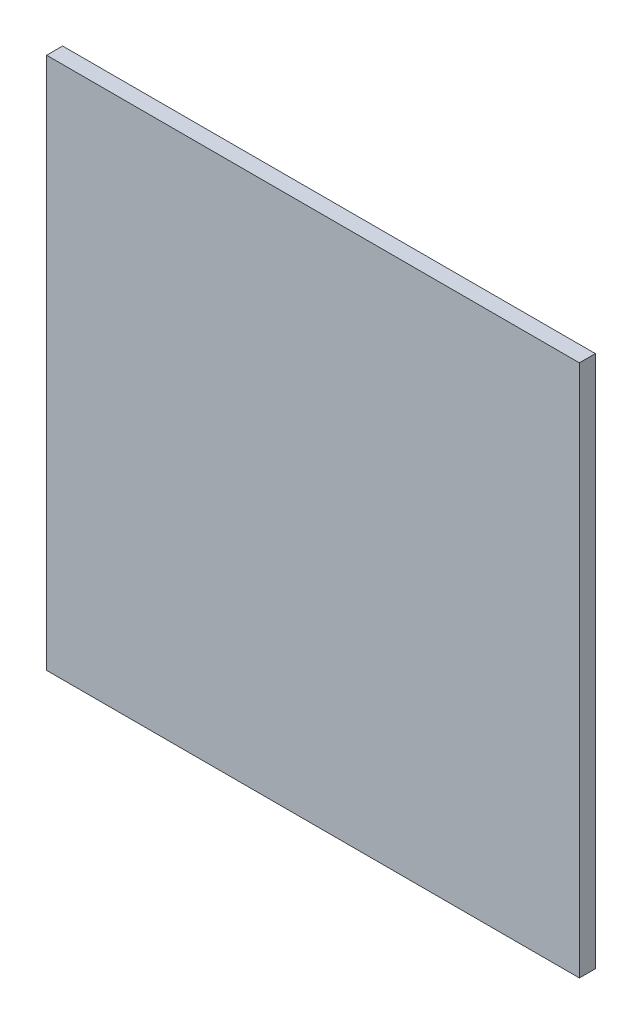
ISO-10303-21;
HEADER;
FILE_DESCRIPTION(('STEP AP214'),'2;1');
FILE_NAME('part.step','',(''),(''),'','','');
FILE_SCHEMA(('AUTOMOTIVE_DESIGN { 1 0 10303 214 1 1 1 1 }'));
ENDSEC;
DATA;
#1=APPLICATION_CONTEXT('core data for automotive mechanical design processes');
#2=APPLICATION_PROTOCOL_DEFINITION('international standard','automotive_design',2000,#1);
#3=PRODUCT_CONTEXT('',#1,'mechanical');
#4=PRODUCT('Part','Part','',(#3));
#5=PRODUCT_RELATED_PRODUCT_CATEGORY('part','',(#4));
#6=PRODUCT_DEFINITION_FORMATION('','',#4);
#7=PRODUCT_DEFINITION_CONTEXT('part definition',#1,'design');
#8=PRODUCT_DEFINITION('design','',#6,#7);
#9=PRODUCT_DEFINITION_SHAPE('','',#8);
#10=(LENGTH_UNIT() NAMED_UNIT(*) SI_UNIT(.MILLI.,.METRE.));
#11=(NAMED_UNIT(*) PLANE_ANGLE_UNIT() SI_UNIT($,.RADIAN.));
#12=(NAMED_UNIT(*) SI_UNIT($,.STERADIAN.) SOLID_ANGLE_UNIT());
#13=UNCERTAINTY_MEASURE_WITH_UNIT(LENGTH_MEASURE(1.E-05),#10,'distance_accuracy_value','');
#14=(GEOMETRIC_REPRESENTATION_CONTEXT(3) GLOBAL_UNCERTAINTY_ASSIGNED_CONTEXT((#13)) GLOBAL_UNIT_ASSIGNED_CONTEXT((#10,
#11,#12)) REPRESENTATION_CONTEXT('',''));
#15=CARTESIAN_POINT('',(0.,0.,0.));
#16=DIRECTION('',(0.,0.,1.));
#17=DIRECTION('',(1.,0.,0.));
#18=AXIS2_PLACEMENT_3D('',#15,#16,#17);
#19=CARTESIAN_POINT('',(50.,-50.,3.));
#20=DIRECTION('',(-1.,0.,0.));
#21=DIRECTION('',(0.,-1.,0.));
#22=AXIS2_PLACEMENT_3D('',#19,#20,#21);
#23=PLANE('',#22);
#24=DIRECTION('',(0.,1.,0.));
#25=VECTOR('',#24,1.);
#26=CARTESIAN_POINT('',(50.,-50.,0.));
#27=LINE('',#26,#25);
#28=CARTESIAN_POINT('',(50.,-50.,0.));
#29=VERTEX_POINT('',#28);
#30=CARTESIAN_POINT('',(50.,50.,0.));
#31=VERTEX_POINT('',#30);
#32=EDGE_CURVE('E96',#29,#31,#27,.T.);
#33=ORIENTED_EDGE('',*,*,#32,.T.);
#34=DIRECTION('',(0.,0.,-1.));
#35=VECTOR('',#34,1.);
#36=CARTESIAN_POINT('',(50.,50.,3.));
#37=LINE('',#36,#35);
#38=CARTESIAN_POINT('',(50.,50.,3.));
#39=VERTEX_POINT('',#38);
#40=EDGE_CURVE('E11',#39,#31,#37,.T.);
#41=ORIENTED_EDGE('',*,*,#40,.F.);
#42=DIRECTION('',(0.,1.,0.));
#43=VECTOR('',#42,1.);
#44=CARTESIAN_POINT('',(50.,-50.,3.));
#45=LINE('',#44,#43);
#46=CARTESIAN_POINT('',(50.,-50.,3.));
#47=VERTEX_POINT('',#46);
#48=EDGE_CURVE('E84',#47,#39,#45,.T.);
#49=ORIENTED_EDGE('',*,*,#48,.F.);
#50=DIRECTION('',(0.,0.,-1.));
#51=VECTOR('',#50,1.);
#52=CARTESIAN_POINT('',(50.,-50.,3.));
#53=LINE('',#52,#51);
#54=EDGE_CURVE('E92',#47,#29,#53,.T.);
#55=ORIENTED_EDGE('',*,*,#54,.T.);
#56=EDGE_LOOP('',(#33,#41,#49,#55));
#57=FACE_BOUND('',#56,.T.);
#58=ADVANCED_FACE('F33',(#57),#23,.F.);
#59=CARTESIAN_POINT('',(-50.,50.,3.));
#60=DIRECTION('',(0.,-1.,0.));
#61=DIRECTION('',(0.,0.,-1.));
#62=AXIS2_PLACEMENT_3D('',#59,#60,#61);
#63=PLANE('',#62);
#64=DIRECTION('',(-1.,0.,0.));
#65=VECTOR('',#64,1.);
#66=CARTESIAN_POINT('',(-50.,50.,0.));
#67=LINE('',#66,#65);
#68=CARTESIAN_POINT('',(-50.,50.,0.));
#69=VERTEX_POINT('',#68);
#70=EDGE_CURVE('E88',#31,#69,#67,.T.);
#71=ORIENTED_EDGE('',*,*,#70,.T.);
#72=DIRECTION('',(0.,0.,-1.));
#73=VECTOR('',#72,1.);
#74=CARTESIAN_POINT('',(-50.,50.,3.));
#75=LINE('',#74,#73);
#76=CARTESIAN_POINT('',(-50.,50.,3.));
#77=VERTEX_POINT('',#76);
#78=EDGE_CURVE('E41',#77,#69,#75,.T.);
#79=ORIENTED_EDGE('',*,*,#78,.F.);
#80=DIRECTION('',(-1.,0.,0.));
#81=VECTOR('',#80,1.);
#82=CARTESIAN_POINT('',(-50.,50.,3.));
#83=LINE('',#82,#81);
#84=EDGE_CURVE('E79',#39,#77,#83,.T.);
#85=ORIENTED_EDGE('',*,*,#84,.F.);
#86=ORIENTED_EDGE('',*,*,#40,.T.);
#87=EDGE_LOOP('',(#71,#79,#85,#86));
#88=FACE_BOUND('',#87,.T.);
#89=ADVANCED_FACE('F87',(#88),#63,.F.);
#90=CARTESIAN_POINT('',(-50.,-50.,3.));
#91=DIRECTION('',(1.,0.,0.));
#92=DIRECTION('',(0.,1.,0.));
#93=AXIS2_PLACEMENT_3D('',#90,#91,#92);
#94=PLANE('',#93);
#95=DIRECTION('',(0.,-1.,0.));
#96=VECTOR('',#95,1.);
#97=CARTESIAN_POINT('',(-50.,-50.,0.));
#98=LINE('',#97,#96);
#99=CARTESIAN_POINT('',(-50.,-50.,0.));
#100=VERTEX_POINT('',#99);
#101=EDGE_CURVE('E66',#69,#100,#98,.T.);
#102=ORIENTED_EDGE('',*,*,#101,.T.);
#103=DIRECTION('',(0.,0.,-1.));
#104=VECTOR('',#103,1.);
#105=CARTESIAN_POINT('',(-50.,-50.,3.));
#106=LINE('',#105,#104);
#107=CARTESIAN_POINT('',(-50.,-50.,3.));
#108=VERTEX_POINT('',#107);
#109=EDGE_CURVE('E89',#108,#100,#106,.T.);
#110=ORIENTED_EDGE('',*,*,#109,.F.);
#111=DIRECTION('',(0.,-1.,0.));
#112=VECTOR('',#111,1.);
#113=CARTESIAN_POINT('',(-50.,-50.,3.));
#114=LINE('',#113,#112);
#115=EDGE_CURVE('E82',#77,#108,#114,.T.);
#116=ORIENTED_EDGE('',*,*,#115,.F.);
#117=ORIENTED_EDGE('',*,*,#78,.T.);
#118=EDGE_LOOP('',(#102,#110,#116,#117));
#119=FACE_BOUND('',#118,.T.);
#120=ADVANCED_FACE('F90',(#119),#94,.F.);
#121=CARTESIAN_POINT('',(-50.,-50.,3.));
#122=DIRECTION('',(0.,1.,0.));
#123=DIRECTION('',(0.,0.,1.));
#124=AXIS2_PLACEMENT_3D('',#121,#122,#123);
#125=PLANE('',#124);
#126=DIRECTION('',(1.,0.,0.));
#127=VECTOR('',#126,1.);
#128=CARTESIAN_POINT('',(-50.,-50.,0.));
#129=LINE('',#128,#127);
#130=EDGE_CURVE('E72',#100,#29,#129,.T.);
#131=ORIENTED_EDGE('',*,*,#130,.T.);
#132=ORIENTED_EDGE('',*,*,#54,.F.);
#133=DIRECTION('',(1.,0.,0.));
#134=VECTOR('',#133,1.);
#135=CARTESIAN_POINT('',(-50.,-50.,3.));
#136=LINE('',#135,#134);
#137=EDGE_CURVE('E49',#108,#47,#136,.T.);
#138=ORIENTED_EDGE('',*,*,#137,.F.);
#139=ORIENTED_EDGE('',*,*,#109,.T.);
#140=EDGE_LOOP('',(#131,#132,#138,#139));
#141=FACE_BOUND('',#140,.T.);
#142=ADVANCED_FACE('F103',(#141),#125,.F.);
#143=CARTESIAN_POINT('',(0.,0.,3.));
#144=DIRECTION('',(0.,0.,-1.));
#145=DIRECTION('',(-1.,0.,0.));
#146=AXIS2_PLACEMENT_3D('',#143,#144,#145);
#147=PLANE('',#146);
#148=ORIENTED_EDGE('',*,*,#48,.T.);
#149=ORIENTED_EDGE('',*,*,#84,.T.);
#150=ORIENTED_EDGE('',*,*,#115,.T.);
#151=ORIENTED_EDGE('',*,*,#137,.T.);
#152=EDGE_LOOP('',(#148,#149,#150,#151));
#153=FACE_BOUND('',#152,.T.);
#154=ADVANCED_FACE('F80',(#153),#147,.F.);
#155=CARTESIAN_POINT('',(0.,0.,0.));
#156=DIRECTION('',(0.,0.,-1.));
#157=DIRECTION('',(-1.,0.,0.));
#158=AXIS2_PLACEMENT_3D('',#155,#156,#157);
#159=PLANE('',#158);
#160=ORIENTED_EDGE('',*,*,#32,.F.);
#161=ORIENTED_EDGE('',*,*,#130,.F.);
#162=ORIENTED_EDGE('',*,*,#101,.F.);
#163=ORIENTED_EDGE('',*,*,#70,.F.);
#164=EDGE_LOOP('',(#160,#161,#162,#163));
#165=FACE_BOUND('',#164,.T.);
#166=ADVANCED_FACE('F106',(#165),#159,.T.);
#167=CLOSED_SHELL('',(#58,#89,#120,#142,#154,#166));
#168=MANIFOLD_SOLID_BREP('B2',#167);
#169=ADVANCED_BREP_SHAPE_REPRESENTATION('',(#18,#168),#14);
#170=SHAPE_DEFINITION_REPRESENTATION(#9,#169);
ENDSEC;
END-ISO-10303-21;
